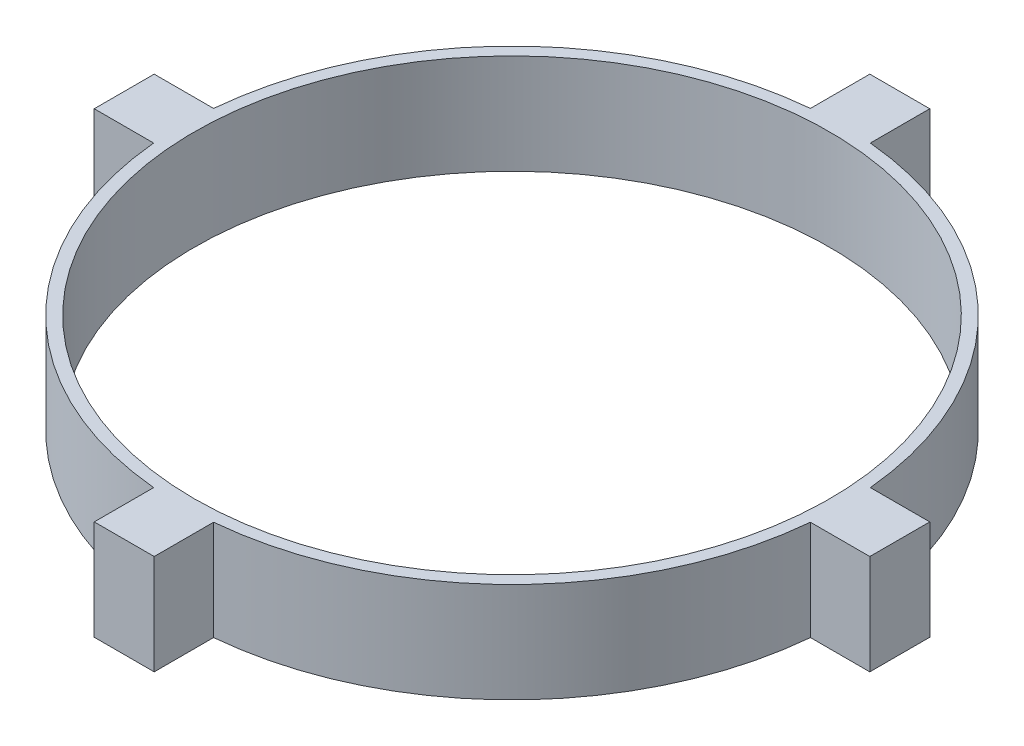
ISO-10303-21;
HEADER;
FILE_DESCRIPTION(('STEP AP214'),'2;1');
FILE_NAME('part.step','',(''),(''),'','','');
FILE_SCHEMA(('AUTOMOTIVE_DESIGN { 1 0 10303 214 1 1 1 1 }'));
ENDSEC;
DATA;
#1=APPLICATION_CONTEXT('core data for automotive mechanical design processes');
#2=APPLICATION_PROTOCOL_DEFINITION('international standard','automotive_design',2000,#1);
#3=PRODUCT_CONTEXT('',#1,'mechanical');
#4=PRODUCT('Part','Part','',(#3));
#5=PRODUCT_RELATED_PRODUCT_CATEGORY('part','',(#4));
#6=PRODUCT_DEFINITION_FORMATION('','',#4);
#7=PRODUCT_DEFINITION_CONTEXT('part definition',#1,'design');
#8=PRODUCT_DEFINITION('design','',#6,#7);
#9=PRODUCT_DEFINITION_SHAPE('','',#8);
#10=(LENGTH_UNIT() NAMED_UNIT(*) SI_UNIT(.MILLI.,.METRE.));
#11=(NAMED_UNIT(*) PLANE_ANGLE_UNIT() SI_UNIT($,.RADIAN.));
#12=(NAMED_UNIT(*) SI_UNIT($,.STERADIAN.) SOLID_ANGLE_UNIT());
#13=UNCERTAINTY_MEASURE_WITH_UNIT(LENGTH_MEASURE(1.E-05),#10,'distance_accuracy_value','');
#14=(GEOMETRIC_REPRESENTATION_CONTEXT(3) GLOBAL_UNCERTAINTY_ASSIGNED_CONTEXT((#13)) GLOBAL_UNIT_ASSIGNED_CONTEXT((#10,
#11,#12)) REPRESENTATION_CONTEXT('',''));
#15=CARTESIAN_POINT('',(0.,0.,0.));
#16=DIRECTION('',(0.,0.,1.));
#17=DIRECTION('',(1.,0.,0.));
#18=AXIS2_PLACEMENT_3D('',#15,#16,#17);
#19=CARTESIAN_POINT('',(0.,12.7,0.));
#20=DIRECTION('',(0.,1.,0.));
#21=DIRECTION('',(0.,0.,1.));
#22=AXIS2_PLACEMENT_3D('',#19,#20,#21);
#23=PLANE('',#22);
#24=CARTESIAN_POINT('',(0.,12.7,0.));
#25=DIRECTION('',(0.,1.,0.));
#26=DIRECTION('',(0.,0.,1.));
#27=AXIS2_PLACEMENT_3D('',#24,#25,#26);
#28=CIRCLE('',#27,40.386);
#29=CARTESIAN_POINT('',(0.,12.7,40.386));
#30=VERTEX_POINT('',#29);
#31=EDGE_CURVE('E195',#30,#30,#28,.T.);
#32=ORIENTED_EDGE('',*,*,#31,.F.);
#33=EDGE_LOOP('',(#32));
#34=FACE_BOUND('',#33,.T.);
#35=CARTESIAN_POINT('',(0.,12.7,0.));
#36=DIRECTION('',(0.,1.,0.));
#37=DIRECTION('',(0.,0.,1.));
#38=AXIS2_PLACEMENT_3D('',#35,#36,#37);
#39=CIRCLE('',#38,41.91);
#40=CARTESIAN_POINT('',(-3.81000000000015,12.7,-41.7364588818936));
#41=VERTEX_POINT('',#40);
#42=CARTESIAN_POINT('',(-41.7364588818937,12.7,-3.81));
#43=VERTEX_POINT('',#42);
#44=EDGE_CURVE('E206',#41,#43,#39,.T.);
#45=ORIENTED_EDGE('',*,*,#44,.T.);
#46=DIRECTION('',(-1.,0.,0.));
#47=VECTOR('',#46,1.);
#48=CARTESIAN_POINT('',(-42.5404502515598,12.6999999999998,-3.81));
#49=LINE('',#48,#47);
#50=CARTESIAN_POINT('',(-49.2884162003989,12.6999999999998,-3.81));
#51=VERTEX_POINT('',#50);
#52=EDGE_CURVE('E246',#43,#51,#49,.T.);
#53=ORIENTED_EDGE('',*,*,#52,.T.);
#54=DIRECTION('',(0.,0.,-1.));
#55=VECTOR('',#54,1.);
#56=CARTESIAN_POINT('',(-49.2884162003989,12.6999999999998,3.81));
#57=LINE('',#56,#55);
#58=CARTESIAN_POINT('',(-49.2884162003989,12.6999999999998,3.81));
#59=VERTEX_POINT('',#58);
#60=EDGE_CURVE('E270',#59,#51,#57,.T.);
#61=ORIENTED_EDGE('',*,*,#60,.F.);
#62=DIRECTION('',(-1.,0.,0.));
#63=VECTOR('',#62,1.);
#64=CARTESIAN_POINT('',(-42.5404502515598,12.6999999999998,3.81));
#65=LINE('',#64,#63);
#66=CARTESIAN_POINT('',(-41.7364588818937,12.7,3.81));
#67=VERTEX_POINT('',#66);
#68=EDGE_CURVE('E256',#67,#59,#65,.T.);
#69=ORIENTED_EDGE('',*,*,#68,.F.);
#70=CARTESIAN_POINT('',(0.,12.7,0.));
#71=DIRECTION('',(0.,1.,0.));
#72=DIRECTION('',(0.,0.,1.));
#73=AXIS2_PLACEMENT_3D('',#70,#71,#72);
#74=CIRCLE('',#73,41.91);
#75=CARTESIAN_POINT('',(-3.80999999999955,12.7,41.7364588818937));
#76=VERTEX_POINT('',#75);
#77=EDGE_CURVE('E197',#67,#76,#74,.T.);
#78=ORIENTED_EDGE('',*,*,#77,.T.);
#79=DIRECTION('',(0.,0.,1.));
#80=VECTOR('',#79,1.);
#81=CARTESIAN_POINT('',(-3.80999999999955,12.6999999999998,42.5404502515599));
#82=LINE('',#81,#80);
#83=CARTESIAN_POINT('',(-3.80999999999948,12.6999999999998,49.2884162003989));
#84=VERTEX_POINT('',#83);
#85=EDGE_CURVE('E224',#76,#84,#82,.T.);
#86=ORIENTED_EDGE('',*,*,#85,.T.);
#87=DIRECTION('',(-1.,0.,0.));
#88=VECTOR('',#87,1.);
#89=CARTESIAN_POINT('',(3.81000000000052,12.6999999999998,49.2884162003989));
#90=LINE('',#89,#88);
#91=CARTESIAN_POINT('',(3.81000000000052,12.6999999999998,49.2884162003989));
#92=VERTEX_POINT('',#91);
#93=EDGE_CURVE('E164',#92,#84,#90,.T.);
#94=ORIENTED_EDGE('',*,*,#93,.F.);
#95=DIRECTION('',(0.,0.,1.));
#96=VECTOR('',#95,1.);
#97=CARTESIAN_POINT('',(3.81000000000045,12.6999999999998,42.5404502515598));
#98=LINE('',#97,#96);
#99=CARTESIAN_POINT('',(3.81000000000045,12.7,41.7364588818936));
#100=VERTEX_POINT('',#99);
#101=EDGE_CURVE('E158',#100,#92,#98,.T.);
#102=ORIENTED_EDGE('',*,*,#101,.F.);
#103=CARTESIAN_POINT('',(0.,12.7,0.));
#104=DIRECTION('',(0.,1.,0.));
#105=DIRECTION('',(0.,0.,1.));
#106=AXIS2_PLACEMENT_3D('',#103,#104,#105);
#107=CIRCLE('',#106,41.91);
#108=CARTESIAN_POINT('',(41.7364588818937,12.7,3.81));
#109=VERTEX_POINT('',#108);
#110=EDGE_CURVE('E162',#100,#109,#107,.T.);
#111=ORIENTED_EDGE('',*,*,#110,.T.);
#112=DIRECTION('',(1.,0.,0.));
#113=VECTOR('',#112,1.);
#114=CARTESIAN_POINT('',(42.5404502515598,12.6999999999998,3.81));
#115=LINE('',#114,#113);
#116=CARTESIAN_POINT('',(49.2884162003989,12.6999999999998,3.81));
#117=VERTEX_POINT('',#116);
#118=EDGE_CURVE('E302',#109,#117,#115,.T.);
#119=ORIENTED_EDGE('',*,*,#118,.T.);
#120=DIRECTION('',(0.,0.,1.));
#121=VECTOR('',#120,1.);
#122=CARTESIAN_POINT('',(49.2884162003989,12.6999999999998,-3.81));
#123=LINE('',#122,#121);
#124=CARTESIAN_POINT('',(49.2884162003989,12.6999999999998,-3.81));
#125=VERTEX_POINT('',#124);
#126=EDGE_CURVE('E322',#125,#117,#123,.T.);
#127=ORIENTED_EDGE('',*,*,#126,.F.);
#128=DIRECTION('',(1.,0.,0.));
#129=VECTOR('',#128,1.);
#130=CARTESIAN_POINT('',(42.5404502515598,12.6999999999998,-3.81));
#131=LINE('',#130,#129);
#132=CARTESIAN_POINT('',(41.7364588818937,12.7,-3.81));
#133=VERTEX_POINT('',#132);
#134=EDGE_CURVE('E66',#133,#125,#131,.T.);
#135=ORIENTED_EDGE('',*,*,#134,.F.);
#136=CARTESIAN_POINT('',(0.,12.7,0.));
#137=DIRECTION('',(0.,1.,0.));
#138=DIRECTION('',(0.,0.,1.));
#139=AXIS2_PLACEMENT_3D('',#136,#137,#138);
#140=CIRCLE('',#139,41.91);
#141=CARTESIAN_POINT('',(3.80999999999985,12.7,-41.7364588818937));
#142=VERTEX_POINT('',#141);
#143=EDGE_CURVE('E199',#133,#142,#140,.T.);
#144=ORIENTED_EDGE('',*,*,#143,.T.);
#145=DIRECTION('',(0.,0.,-1.));
#146=VECTOR('',#145,1.);
#147=CARTESIAN_POINT('',(3.80999999999985,12.6999999999998,-42.5404502515598));
#148=LINE('',#147,#146);
#149=CARTESIAN_POINT('',(3.80999999999983,12.6999999999998,-49.2884162003989));
#150=VERTEX_POINT('',#149);
#151=EDGE_CURVE('E274',#142,#150,#148,.T.);
#152=ORIENTED_EDGE('',*,*,#151,.T.);
#153=DIRECTION('',(1.,0.,0.));
#154=VECTOR('',#153,1.);
#155=CARTESIAN_POINT('',(-3.81000000000017,12.6999999999998,-49.2884162003989));
#156=LINE('',#155,#154);
#157=CARTESIAN_POINT('',(-3.81000000000017,12.6999999999998,-49.2884162003989));
#158=VERTEX_POINT('',#157);
#159=EDGE_CURVE('E298',#158,#150,#156,.T.);
#160=ORIENTED_EDGE('',*,*,#159,.F.);
#161=DIRECTION('',(0.,0.,-1.));
#162=VECTOR('',#161,1.);
#163=CARTESIAN_POINT('',(-3.81000000000015,12.6999999999998,-42.5404502515598));
#164=LINE('',#163,#162);
#165=EDGE_CURVE('E284',#41,#158,#164,.T.);
#166=ORIENTED_EDGE('',*,*,#165,.F.);
#167=EDGE_LOOP('',(#45,#53,#61,#69,#78,#86,#94,#102,#111,#119,#127,#135,#144,#152,#160,#166));
#168=FACE_BOUND('',#167,.T.);
#169=ADVANCED_FACE('F41',(#34,#168),#23,.T.);
#170=CARTESIAN_POINT('',(0.,0.,0.));
#171=DIRECTION('',(0.,1.,0.));
#172=DIRECTION('',(0.,0.,1.));
#173=AXIS2_PLACEMENT_3D('',#170,#171,#172);
#174=PLANE('',#173);
#175=CARTESIAN_POINT('',(0.,0.,0.));
#176=DIRECTION('',(0.,1.,0.));
#177=DIRECTION('',(0.,0.,1.));
#178=AXIS2_PLACEMENT_3D('',#175,#176,#177);
#179=CIRCLE('',#178,40.386);
#180=CARTESIAN_POINT('',(0.,0.,40.386));
#181=VERTEX_POINT('',#180);
#182=EDGE_CURVE('E45',#181,#181,#179,.T.);
#183=ORIENTED_EDGE('',*,*,#182,.T.);
#184=EDGE_LOOP('',(#183));
#185=FACE_BOUND('',#184,.T.);
#186=DIRECTION('',(-1.,0.,0.));
#187=VECTOR('',#186,1.);
#188=CARTESIAN_POINT('',(-42.5404502515598,-2.40362718565225E-06,-3.81));
#189=LINE('',#188,#187);
#190=CARTESIAN_POINT('',(-41.7364588818937,0.,-3.81));
#191=VERTEX_POINT('',#190);
#192=CARTESIAN_POINT('',(-49.2884162003989,-2.40362718565225E-06,-3.81));
#193=VERTEX_POINT('',#192);
#194=EDGE_CURVE('E253',#191,#193,#189,.T.);
#195=ORIENTED_EDGE('',*,*,#194,.F.);
#196=CARTESIAN_POINT('',(0.,0.,0.));
#197=DIRECTION('',(0.,1.,0.));
#198=DIRECTION('',(0.,0.,1.));
#199=AXIS2_PLACEMENT_3D('',#196,#197,#198);
#200=CIRCLE('',#199,41.91);
#201=CARTESIAN_POINT('',(-3.81000000000015,0.,-41.7364588818936));
#202=VERTEX_POINT('',#201);
#203=EDGE_CURVE('E11',#202,#191,#200,.T.);
#204=ORIENTED_EDGE('',*,*,#203,.F.);
#205=DIRECTION('',(0.,0.,-1.));
#206=VECTOR('',#205,1.);
#207=CARTESIAN_POINT('',(-3.81000000000015,-2.40362718565225E-06,-42.5404502515598));
#208=LINE('',#207,#206);
#209=CARTESIAN_POINT('',(-3.81000000000017,-2.40362718565225E-06,-49.2884162003989));
#210=VERTEX_POINT('',#209);
#211=EDGE_CURVE('E291',#202,#210,#208,.T.);
#212=ORIENTED_EDGE('',*,*,#211,.T.);
#213=DIRECTION('',(1.,0.,0.));
#214=VECTOR('',#213,1.);
#215=CARTESIAN_POINT('',(-3.81000000000017,-2.40362718565225E-06,-49.2884162003989));
#216=LINE('',#215,#214);
#217=CARTESIAN_POINT('',(3.80999999999983,-2.40362718565225E-06,-49.2884162003989));
#218=VERTEX_POINT('',#217);
#219=EDGE_CURVE('E294',#210,#218,#216,.T.);
#220=ORIENTED_EDGE('',*,*,#219,.T.);
#221=DIRECTION('',(0.,0.,-1.));
#222=VECTOR('',#221,1.);
#223=CARTESIAN_POINT('',(3.80999999999985,-2.40362718565225E-06,-42.5404502515598));
#224=LINE('',#223,#222);
#225=CARTESIAN_POINT('',(3.80999999999985,0.,-41.7364588818937));
#226=VERTEX_POINT('',#225);
#227=EDGE_CURVE('E281',#226,#218,#224,.T.);
#228=ORIENTED_EDGE('',*,*,#227,.F.);
#229=CARTESIAN_POINT('',(0.,0.,0.));
#230=DIRECTION('',(0.,1.,0.));
#231=DIRECTION('',(0.,0.,1.));
#232=AXIS2_PLACEMENT_3D('',#229,#230,#231);
#233=CIRCLE('',#232,41.91);
#234=CARTESIAN_POINT('',(41.7364588818937,0.,-3.81));
#235=VERTEX_POINT('',#234);
#236=EDGE_CURVE('E51',#235,#226,#233,.T.);
#237=ORIENTED_EDGE('',*,*,#236,.F.);
#238=DIRECTION('',(1.,0.,0.));
#239=VECTOR('',#238,1.);
#240=CARTESIAN_POINT('',(42.5404502515598,-2.40362718565225E-06,-3.81));
#241=LINE('',#240,#239);
#242=CARTESIAN_POINT('',(49.2884162003989,-2.40362718565225E-06,-3.81));
#243=VERTEX_POINT('',#242);
#244=EDGE_CURVE('E58',#235,#243,#241,.T.);
#245=ORIENTED_EDGE('',*,*,#244,.T.);
#246=DIRECTION('',(0.,0.,1.));
#247=VECTOR('',#246,1.);
#248=CARTESIAN_POINT('',(49.2884162003989,-2.40362718565225E-06,-3.81));
#249=LINE('',#248,#247);
#250=CARTESIAN_POINT('',(49.2884162003989,-2.40362718565225E-06,3.81));
#251=VERTEX_POINT('',#250);
#252=EDGE_CURVE('E319',#243,#251,#249,.T.);
#253=ORIENTED_EDGE('',*,*,#252,.T.);
#254=DIRECTION('',(1.,0.,0.));
#255=VECTOR('',#254,1.);
#256=CARTESIAN_POINT('',(42.5404502515598,-2.40362718565225E-06,3.81));
#257=LINE('',#256,#255);
#258=CARTESIAN_POINT('',(41.7364588818937,0.,3.81));
#259=VERTEX_POINT('',#258);
#260=EDGE_CURVE('E309',#259,#251,#257,.T.);
#261=ORIENTED_EDGE('',*,*,#260,.F.);
#262=CARTESIAN_POINT('',(0.,0.,0.));
#263=DIRECTION('',(0.,1.,0.));
#264=DIRECTION('',(0.,0.,1.));
#265=AXIS2_PLACEMENT_3D('',#262,#263,#264);
#266=CIRCLE('',#265,41.91);
#267=CARTESIAN_POINT('',(3.81000000000045,0.,41.7364588818936));
#268=VERTEX_POINT('',#267);
#269=EDGE_CURVE('E330',#268,#259,#266,.T.);
#270=ORIENTED_EDGE('',*,*,#269,.F.);
#271=DIRECTION('',(0.,0.,1.));
#272=VECTOR('',#271,1.);
#273=CARTESIAN_POINT('',(3.81000000000045,-2.40362718565225E-06,42.5404502515598));
#274=LINE('',#273,#272);
#275=CARTESIAN_POINT('',(3.81000000000052,-2.40362718565225E-06,49.2884162003989));
#276=VERTEX_POINT('',#275);
#277=EDGE_CURVE('E175',#268,#276,#274,.T.);
#278=ORIENTED_EDGE('',*,*,#277,.T.);
#279=DIRECTION('',(-1.,0.,0.));
#280=VECTOR('',#279,1.);
#281=CARTESIAN_POINT('',(3.81000000000052,-2.40362718565225E-06,49.2884162003989));
#282=LINE('',#281,#280);
#283=CARTESIAN_POINT('',(-3.80999999999948,-2.40362718565225E-06,49.2884162003989));
#284=VERTEX_POINT('',#283);
#285=EDGE_CURVE('E240',#276,#284,#282,.T.);
#286=ORIENTED_EDGE('',*,*,#285,.T.);
#287=DIRECTION('',(0.,0.,1.));
#288=VECTOR('',#287,1.);
#289=CARTESIAN_POINT('',(-3.80999999999955,-2.40362718565225E-06,42.5404502515599));
#290=LINE('',#289,#288);
#291=CARTESIAN_POINT('',(-3.80999999999955,0.,41.7364588818937));
#292=VERTEX_POINT('',#291);
#293=EDGE_CURVE('E170',#292,#284,#290,.T.);
#294=ORIENTED_EDGE('',*,*,#293,.F.);
#295=CARTESIAN_POINT('',(0.,0.,0.));
#296=DIRECTION('',(0.,1.,0.));
#297=DIRECTION('',(0.,0.,1.));
#298=AXIS2_PLACEMENT_3D('',#295,#296,#297);
#299=CIRCLE('',#298,41.91);
#300=CARTESIAN_POINT('',(-41.7364588818937,0.,3.81));
#301=VERTEX_POINT('',#300);
#302=EDGE_CURVE('E326',#301,#292,#299,.T.);
#303=ORIENTED_EDGE('',*,*,#302,.F.);
#304=DIRECTION('',(-1.,0.,0.));
#305=VECTOR('',#304,1.);
#306=CARTESIAN_POINT('',(-42.5404502515598,-2.40362718565225E-06,3.81));
#307=LINE('',#306,#305);
#308=CARTESIAN_POINT('',(-49.2884162003989,-2.40362718565225E-06,3.81));
#309=VERTEX_POINT('',#308);
#310=EDGE_CURVE('E263',#301,#309,#307,.T.);
#311=ORIENTED_EDGE('',*,*,#310,.T.);
#312=DIRECTION('',(0.,0.,-1.));
#313=VECTOR('',#312,1.);
#314=CARTESIAN_POINT('',(-49.2884162003989,-2.40362718565225E-06,3.81));
#315=LINE('',#314,#313);
#316=EDGE_CURVE('E266',#309,#193,#315,.T.);
#317=ORIENTED_EDGE('',*,*,#316,.T.);
#318=EDGE_LOOP('',(#195,#204,#212,#220,#228,#237,#245,#253,#261,#270,#278,#286,#294,#303,#311,#317));
#319=FACE_BOUND('',#318,.T.);
#320=ADVANCED_FACE('F43',(#185,#319),#174,.F.);
#321=CARTESIAN_POINT('',(0.,0.,-3.81));
#322=DIRECTION('',(0.,0.,1.));
#323=DIRECTION('',(1.,0.,0.));
#324=AXIS2_PLACEMENT_3D('',#321,#322,#323);
#325=PLANE('',#324);
#326=ORIENTED_EDGE('',*,*,#244,.F.);
#327=DIRECTION('',(0.,1.,0.));
#328=VECTOR('',#327,1.);
#329=CARTESIAN_POINT('',(41.7364588818937,-11.3,-3.81));
#330=LINE('',#329,#328);
#331=EDGE_CURVE('E191',#235,#133,#330,.T.);
#332=ORIENTED_EDGE('',*,*,#331,.T.);
#333=ORIENTED_EDGE('',*,*,#134,.T.);
#334=DIRECTION('',(0.,1.,0.));
#335=VECTOR('',#334,1.);
#336=CARTESIAN_POINT('',(49.2884162003989,-2.40362718565225E-06,-3.81));
#337=LINE('',#336,#335);
#338=EDGE_CURVE('E314',#243,#125,#337,.T.);
#339=ORIENTED_EDGE('',*,*,#338,.F.);
#340=EDGE_LOOP('',(#326,#332,#333,#339));
#341=FACE_BOUND('',#340,.T.);
#342=ADVANCED_FACE('F383',(#341),#325,.F.);
#343=CARTESIAN_POINT('',(0.,0.,3.81));
#344=DIRECTION('',(0.,0.,1.));
#345=DIRECTION('',(1.,0.,0.));
#346=AXIS2_PLACEMENT_3D('',#343,#344,#345);
#347=PLANE('',#346);
#348=ORIENTED_EDGE('',*,*,#118,.F.);
#349=DIRECTION('',(0.,1.,0.));
#350=VECTOR('',#349,1.);
#351=CARTESIAN_POINT('',(41.7364588818937,-11.3,3.81));
#352=LINE('',#351,#350);
#353=EDGE_CURVE('E180',#259,#109,#352,.T.);
#354=ORIENTED_EDGE('',*,*,#353,.F.);
#355=ORIENTED_EDGE('',*,*,#260,.T.);
#356=DIRECTION('',(0.,1.,0.));
#357=VECTOR('',#356,1.);
#358=CARTESIAN_POINT('',(49.2884162003989,-2.40362718565225E-06,3.81));
#359=LINE('',#358,#357);
#360=EDGE_CURVE('E305',#251,#117,#359,.T.);
#361=ORIENTED_EDGE('',*,*,#360,.T.);
#362=EDGE_LOOP('',(#348,#354,#355,#361));
#363=FACE_BOUND('',#362,.T.);
#364=ADVANCED_FACE('F379',(#363),#347,.T.);
#365=CARTESIAN_POINT('',(49.2884162003989,-2.40362718565225E-06,-3.81));
#366=DIRECTION('',(1.,0.,0.));
#367=DIRECTION('',(0.,0.,-1.));
#368=AXIS2_PLACEMENT_3D('',#365,#366,#367);
#369=PLANE('',#368);
#370=ORIENTED_EDGE('',*,*,#126,.T.);
#371=ORIENTED_EDGE('',*,*,#360,.F.);
#372=ORIENTED_EDGE('',*,*,#252,.F.);
#373=ORIENTED_EDGE('',*,*,#338,.T.);
#374=EDGE_LOOP('',(#370,#371,#372,#373));
#375=FACE_BOUND('',#374,.T.);
#376=ADVANCED_FACE('F382',(#375),#369,.T.);
#377=CARTESIAN_POINT('',(-3.81,0.,0.));
#378=DIRECTION('',(1.,0.,0.));
#379=DIRECTION('',(0.,0.,-1.));
#380=AXIS2_PLACEMENT_3D('',#377,#378,#379);
#381=PLANE('',#380);
#382=ORIENTED_EDGE('',*,*,#211,.F.);
#383=DIRECTION('',(0.,1.,0.));
#384=VECTOR('',#383,1.);
#385=CARTESIAN_POINT('',(-3.81000000000015,-11.3,-41.7364588818936));
#386=LINE('',#385,#384);
#387=EDGE_CURVE('E209',#202,#41,#386,.T.);
#388=ORIENTED_EDGE('',*,*,#387,.T.);
#389=ORIENTED_EDGE('',*,*,#165,.T.);
#390=DIRECTION('',(0.,1.,0.));
#391=VECTOR('',#390,1.);
#392=CARTESIAN_POINT('',(-3.81000000000017,-2.40362718565225E-06,-49.2884162003989));
#393=LINE('',#392,#391);
#394=EDGE_CURVE('E287',#210,#158,#393,.T.);
#395=ORIENTED_EDGE('',*,*,#394,.F.);
#396=EDGE_LOOP('',(#382,#388,#389,#395));
#397=FACE_BOUND('',#396,.T.);
#398=ADVANCED_FACE('F349',(#397),#381,.F.);
#399=CARTESIAN_POINT('',(3.81,0.,0.));
#400=DIRECTION('',(1.,0.,0.));
#401=DIRECTION('',(0.,0.,-1.));
#402=AXIS2_PLACEMENT_3D('',#399,#400,#401);
#403=PLANE('',#402);
#404=ORIENTED_EDGE('',*,*,#151,.F.);
#405=DIRECTION('',(0.,1.,0.));
#406=VECTOR('',#405,1.);
#407=CARTESIAN_POINT('',(3.80999999999985,-11.3,-41.7364588818937));
#408=LINE('',#407,#406);
#409=EDGE_CURVE('E186',#226,#142,#408,.T.);
#410=ORIENTED_EDGE('',*,*,#409,.F.);
#411=ORIENTED_EDGE('',*,*,#227,.T.);
#412=DIRECTION('',(0.,1.,0.));
#413=VECTOR('',#412,1.);
#414=CARTESIAN_POINT('',(3.80999999999983,-2.40362718565225E-06,-49.2884162003989));
#415=LINE('',#414,#413);
#416=EDGE_CURVE('E277',#218,#150,#415,.T.);
#417=ORIENTED_EDGE('',*,*,#416,.T.);
#418=EDGE_LOOP('',(#404,#410,#411,#417));
#419=FACE_BOUND('',#418,.T.);
#420=ADVANCED_FACE('F341',(#419),#403,.T.);
#421=CARTESIAN_POINT('',(-3.81000000000017,-2.40362718565225E-06,-49.2884162003989));
#422=DIRECTION('',(0.,0.,-1.));
#423=DIRECTION('',(-1.,0.,0.));
#424=AXIS2_PLACEMENT_3D('',#421,#422,#423);
#425=PLANE('',#424);
#426=ORIENTED_EDGE('',*,*,#159,.T.);
#427=ORIENTED_EDGE('',*,*,#416,.F.);
#428=ORIENTED_EDGE('',*,*,#219,.F.);
#429=ORIENTED_EDGE('',*,*,#394,.T.);
#430=EDGE_LOOP('',(#426,#427,#428,#429));
#431=FACE_BOUND('',#430,.T.);
#432=ADVANCED_FACE('F345',(#431),#425,.T.);
#433=CARTESIAN_POINT('',(0.,0.,3.81));
#434=DIRECTION('',(0.,0.,-1.));
#435=DIRECTION('',(-1.,0.,0.));
#436=AXIS2_PLACEMENT_3D('',#433,#434,#435);
#437=PLANE('',#436);
#438=ORIENTED_EDGE('',*,*,#310,.F.);
#439=DIRECTION('',(0.,1.,0.));
#440=VECTOR('',#439,1.);
#441=CARTESIAN_POINT('',(-41.7364588818937,-11.3,3.81));
#442=LINE('',#441,#440);
#443=EDGE_CURVE('E219',#301,#67,#442,.T.);
#444=ORIENTED_EDGE('',*,*,#443,.T.);
#445=ORIENTED_EDGE('',*,*,#68,.T.);
#446=DIRECTION('',(0.,1.,0.));
#447=VECTOR('',#446,1.);
#448=CARTESIAN_POINT('',(-49.2884162003989,-2.40362718565225E-06,3.81));
#449=LINE('',#448,#447);
#450=EDGE_CURVE('E259',#309,#59,#449,.T.);
#451=ORIENTED_EDGE('',*,*,#450,.F.);
#452=EDGE_LOOP('',(#438,#444,#445,#451));
#453=FACE_BOUND('',#452,.T.);
#454=ADVANCED_FACE('F367',(#453),#437,.F.);
#455=CARTESIAN_POINT('',(0.,0.,-3.81));
#456=DIRECTION('',(0.,0.,-1.));
#457=DIRECTION('',(-1.,0.,0.));
#458=AXIS2_PLACEMENT_3D('',#455,#456,#457);
#459=PLANE('',#458);
#460=ORIENTED_EDGE('',*,*,#52,.F.);
#461=DIRECTION('',(0.,1.,0.));
#462=VECTOR('',#461,1.);
#463=CARTESIAN_POINT('',(-41.7364588818937,-11.3,-3.81));
#464=LINE('',#463,#462);
#465=EDGE_CURVE('E202',#191,#43,#464,.T.);
#466=ORIENTED_EDGE('',*,*,#465,.F.);
#467=ORIENTED_EDGE('',*,*,#194,.T.);
#468=DIRECTION('',(0.,1.,0.));
#469=VECTOR('',#468,1.);
#470=CARTESIAN_POINT('',(-49.2884162003989,-2.40362718565225E-06,-3.81));
#471=LINE('',#470,#469);
#472=EDGE_CURVE('E249',#193,#51,#471,.T.);
#473=ORIENTED_EDGE('',*,*,#472,.T.);
#474=EDGE_LOOP('',(#460,#466,#467,#473));
#475=FACE_BOUND('',#474,.T.);
#476=ADVANCED_FACE('F358',(#475),#459,.T.);
#477=CARTESIAN_POINT('',(-49.2884162003989,-2.40362718565225E-06,3.81));
#478=DIRECTION('',(-1.,0.,0.));
#479=DIRECTION('',(0.,0.,1.));
#480=AXIS2_PLACEMENT_3D('',#477,#478,#479);
#481=PLANE('',#480);
#482=ORIENTED_EDGE('',*,*,#60,.T.);
#483=ORIENTED_EDGE('',*,*,#472,.F.);
#484=ORIENTED_EDGE('',*,*,#316,.F.);
#485=ORIENTED_EDGE('',*,*,#450,.T.);
#486=EDGE_LOOP('',(#482,#483,#484,#485));
#487=FACE_BOUND('',#486,.T.);
#488=ADVANCED_FACE('F362',(#487),#481,.T.);
#489=CARTESIAN_POINT('',(3.81,0.,0.));
#490=DIRECTION('',(-1.,0.,0.));
#491=DIRECTION('',(0.,0.,1.));
#492=AXIS2_PLACEMENT_3D('',#489,#490,#491);
#493=PLANE('',#492);
#494=ORIENTED_EDGE('',*,*,#277,.F.);
#495=DIRECTION('',(0.,1.,0.));
#496=VECTOR('',#495,1.);
#497=CARTESIAN_POINT('',(3.81000000000045,-11.3,41.7364588818936));
#498=LINE('',#497,#496);
#499=EDGE_CURVE('E173',#268,#100,#498,.T.);
#500=ORIENTED_EDGE('',*,*,#499,.T.);
#501=ORIENTED_EDGE('',*,*,#101,.T.);
#502=DIRECTION('',(0.,1.,0.));
#503=VECTOR('',#502,1.);
#504=CARTESIAN_POINT('',(3.81000000000052,-2.40362718565225E-06,49.2884162003989));
#505=LINE('',#504,#503);
#506=EDGE_CURVE('E169',#276,#92,#505,.T.);
#507=ORIENTED_EDGE('',*,*,#506,.F.);
#508=EDGE_LOOP('',(#494,#500,#501,#507));
#509=FACE_BOUND('',#508,.T.);
#510=ADVANCED_FACE('F174',(#509),#493,.F.);
#511=CARTESIAN_POINT('',(-3.81,0.,0.));
#512=DIRECTION('',(-1.,0.,0.));
#513=DIRECTION('',(0.,0.,1.));
#514=AXIS2_PLACEMENT_3D('',#511,#512,#513);
#515=PLANE('',#514);
#516=ORIENTED_EDGE('',*,*,#85,.F.);
#517=DIRECTION('',(0.,1.,0.));
#518=VECTOR('',#517,1.);
#519=CARTESIAN_POINT('',(-3.80999999999955,-11.3,41.7364588818937));
#520=LINE('',#519,#518);
#521=EDGE_CURVE('E220',#292,#76,#520,.T.);
#522=ORIENTED_EDGE('',*,*,#521,.F.);
#523=ORIENTED_EDGE('',*,*,#293,.T.);
#524=DIRECTION('',(0.,1.,0.));
#525=VECTOR('',#524,1.);
#526=CARTESIAN_POINT('',(-3.80999999999948,-2.40362718565225E-06,49.2884162003989));
#527=LINE('',#526,#525);
#528=EDGE_CURVE('E230',#284,#84,#527,.T.);
#529=ORIENTED_EDGE('',*,*,#528,.T.);
#530=EDGE_LOOP('',(#516,#522,#523,#529));
#531=FACE_BOUND('',#530,.T.);
#532=ADVANCED_FACE('F373',(#531),#515,.T.);
#533=CARTESIAN_POINT('',(3.81000000000052,-2.40362718565225E-06,49.2884162003989));
#534=DIRECTION('',(0.,0.,1.));
#535=DIRECTION('',(1.,0.,0.));
#536=AXIS2_PLACEMENT_3D('',#533,#534,#535);
#537=PLANE('',#536);
#538=ORIENTED_EDGE('',*,*,#93,.T.);
#539=ORIENTED_EDGE('',*,*,#528,.F.);
#540=ORIENTED_EDGE('',*,*,#285,.F.);
#541=ORIENTED_EDGE('',*,*,#506,.T.);
#542=EDGE_LOOP('',(#538,#539,#540,#541));
#543=FACE_BOUND('',#542,.T.);
#544=ADVANCED_FACE('F376',(#543),#537,.T.);
#545=CARTESIAN_POINT('',(0.,-11.3,0.));
#546=DIRECTION('',(0.,1.,0.));
#547=DIRECTION('',(0.,0.,1.));
#548=AXIS2_PLACEMENT_3D('',#545,#546,#547);
#549=CYLINDRICAL_SURFACE('',#548,41.91);
#550=ORIENTED_EDGE('',*,*,#302,.T.);
#551=ORIENTED_EDGE('',*,*,#521,.T.);
#552=ORIENTED_EDGE('',*,*,#77,.F.);
#553=ORIENTED_EDGE('',*,*,#443,.F.);
#554=EDGE_LOOP('',(#550,#551,#552,#553));
#555=FACE_BOUND('',#554,.T.);
#556=ADVANCED_FACE('F370',(#555),#549,.T.);
#557=CARTESIAN_POINT('',(0.,-11.3,0.));
#558=DIRECTION('',(0.,1.,0.));
#559=DIRECTION('',(0.,0.,1.));
#560=AXIS2_PLACEMENT_3D('',#557,#558,#559);
#561=CYLINDRICAL_SURFACE('',#560,41.91);
#562=ORIENTED_EDGE('',*,*,#269,.T.);
#563=ORIENTED_EDGE('',*,*,#353,.T.);
#564=ORIENTED_EDGE('',*,*,#110,.F.);
#565=ORIENTED_EDGE('',*,*,#499,.F.);
#566=EDGE_LOOP('',(#562,#563,#564,#565));
#567=FACE_BOUND('',#566,.T.);
#568=ADVANCED_FACE('F183',(#567),#561,.T.);
#569=CARTESIAN_POINT('',(0.,-11.3,0.));
#570=DIRECTION('',(0.,1.,0.));
#571=DIRECTION('',(0.,0.,1.));
#572=AXIS2_PLACEMENT_3D('',#569,#570,#571);
#573=CYLINDRICAL_SURFACE('',#572,41.91);
#574=ORIENTED_EDGE('',*,*,#203,.T.);
#575=ORIENTED_EDGE('',*,*,#465,.T.);
#576=ORIENTED_EDGE('',*,*,#44,.F.);
#577=ORIENTED_EDGE('',*,*,#387,.F.);
#578=EDGE_LOOP('',(#574,#575,#576,#577));
#579=FACE_BOUND('',#578,.T.);
#580=ADVANCED_FACE('F354',(#579),#573,.T.);
#581=CARTESIAN_POINT('',(0.,-11.3,0.));
#582=DIRECTION('',(0.,1.,0.));
#583=DIRECTION('',(0.,0.,1.));
#584=AXIS2_PLACEMENT_3D('',#581,#582,#583);
#585=CYLINDRICAL_SURFACE('',#584,41.91);
#586=ORIENTED_EDGE('',*,*,#236,.T.);
#587=ORIENTED_EDGE('',*,*,#409,.T.);
#588=ORIENTED_EDGE('',*,*,#143,.F.);
#589=ORIENTED_EDGE('',*,*,#331,.F.);
#590=EDGE_LOOP('',(#586,#587,#588,#589));
#591=FACE_BOUND('',#590,.T.);
#592=ADVANCED_FACE('F338',(#591),#585,.T.);
#593=CARTESIAN_POINT('',(0.,-25.4,0.));
#594=DIRECTION('',(0.,1.,0.));
#595=DIRECTION('',(0.,0.,1.));
#596=AXIS2_PLACEMENT_3D('',#593,#594,#595);
#597=CYLINDRICAL_SURFACE('',#596,40.386);
#598=ORIENTED_EDGE('',*,*,#31,.T.);
#599=EDGE_LOOP('',(#598));
#600=FACE_BOUND('',#599,.T.);
#601=ORIENTED_EDGE('',*,*,#182,.F.);
#602=EDGE_LOOP('',(#601));
#603=FACE_BOUND('',#602,.T.);
#604=ADVANCED_FACE('F441',(#600,#603),#597,.F.);
#605=CLOSED_SHELL('',(#169,#320,#342,#364,#376,#398,#420,#432,#454,#476,#488,#510,#532,#544,
#556,#568,#580,#592,#604));
#606=MANIFOLD_SOLID_BREP('B2',#605);
#607=ADVANCED_BREP_SHAPE_REPRESENTATION('',(#18,#606),#14);
#608=SHAPE_DEFINITION_REPRESENTATION(#9,#607);
ENDSEC;
END-ISO-10303-21;
